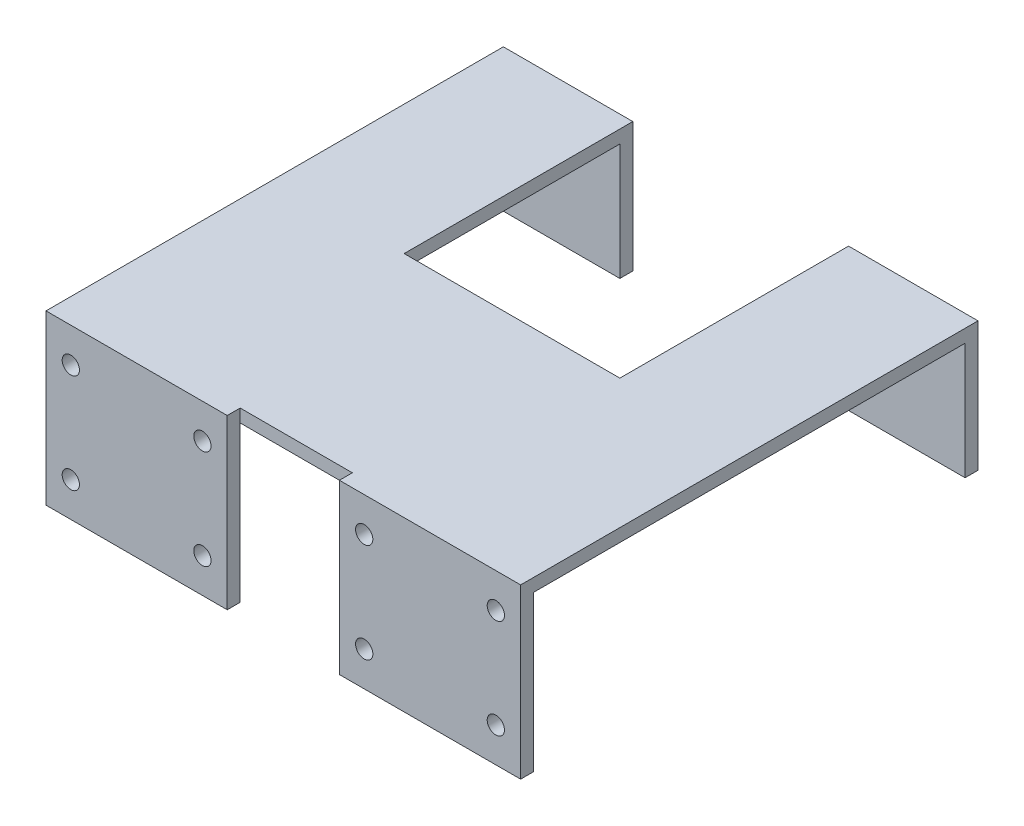
ISO-10303-21;
HEADER;
FILE_DESCRIPTION(('STEP AP214'),'2;1');
FILE_NAME('part.step','',(''),(''),'','','');
FILE_SCHEMA(('AUTOMOTIVE_DESIGN { 1 0 10303 214 1 1 1 1 }'));
ENDSEC;
DATA;
#1=APPLICATION_CONTEXT('core data for automotive mechanical design processes');
#2=APPLICATION_PROTOCOL_DEFINITION('international standard','automotive_design',2000,#1);
#3=PRODUCT_CONTEXT('',#1,'mechanical');
#4=PRODUCT('Part','Part','',(#3));
#5=PRODUCT_RELATED_PRODUCT_CATEGORY('part','',(#4));
#6=PRODUCT_DEFINITION_FORMATION('','',#4);
#7=PRODUCT_DEFINITION_CONTEXT('part definition',#1,'design');
#8=PRODUCT_DEFINITION('design','',#6,#7);
#9=PRODUCT_DEFINITION_SHAPE('','',#8);
#10=(LENGTH_UNIT() NAMED_UNIT(*) SI_UNIT(.MILLI.,.METRE.));
#11=(NAMED_UNIT(*) PLANE_ANGLE_UNIT() SI_UNIT($,.RADIAN.));
#12=(NAMED_UNIT(*) SI_UNIT($,.STERADIAN.) SOLID_ANGLE_UNIT());
#13=UNCERTAINTY_MEASURE_WITH_UNIT(LENGTH_MEASURE(1.E-05),#10,'distance_accuracy_value','');
#14=(GEOMETRIC_REPRESENTATION_CONTEXT(3) GLOBAL_UNCERTAINTY_ASSIGNED_CONTEXT((#13)) GLOBAL_UNIT_ASSIGNED_CONTEXT((#10,
#11,#12)) REPRESENTATION_CONTEXT('',''));
#15=CARTESIAN_POINT('',(0.,0.,0.));
#16=DIRECTION('',(0.,0.,1.));
#17=DIRECTION('',(1.,0.,0.));
#18=AXIS2_PLACEMENT_3D('',#15,#16,#17);
#19=CARTESIAN_POINT('',(-55.,3.,47.7190961890331));
#20=DIRECTION('',(0.,0.,-1.));
#21=DIRECTION('',(-1.,0.,0.));
#22=AXIS2_PLACEMENT_3D('',#19,#20,#21);
#23=PLANE('',#22);
#24=DIRECTION('',(0.,-1.,0.));
#25=VECTOR('',#24,1.);
#26=CARTESIAN_POINT('',(13.,3.,47.7190961890331));
#27=LINE('',#26,#25);
#28=CARTESIAN_POINT('',(13.,3.,47.7190961890331));
#29=VERTEX_POINT('',#28);
#30=CARTESIAN_POINT('',(13.,0.,47.7190961890331));
#31=VERTEX_POINT('',#30);
#32=EDGE_CURVE('E53',#29,#31,#27,.T.);
#33=ORIENTED_EDGE('',*,*,#32,.F.);
#34=DIRECTION('',(1.,0.,0.));
#35=VECTOR('',#34,1.);
#36=CARTESIAN_POINT('',(-55.,3.,47.7190961890331));
#37=LINE('',#36,#35);
#38=CARTESIAN_POINT('',(-13.,3.,47.7190961890331));
#39=VERTEX_POINT('',#38);
#40=EDGE_CURVE('E329',#39,#29,#37,.T.);
#41=ORIENTED_EDGE('',*,*,#40,.F.);
#42=DIRECTION('',(0.,1.,0.));
#43=VECTOR('',#42,1.);
#44=CARTESIAN_POINT('',(-13.,3.,47.7190961890331));
#45=LINE('',#44,#43);
#46=CARTESIAN_POINT('',(-13.,0.,47.7190961890331));
#47=VERTEX_POINT('',#46);
#48=EDGE_CURVE('E11',#47,#39,#45,.T.);
#49=ORIENTED_EDGE('',*,*,#48,.F.);
#50=DIRECTION('',(1.,0.,0.));
#51=VECTOR('',#50,1.);
#52=CARTESIAN_POINT('',(-55.,0.,47.7190961890331));
#53=LINE('',#52,#51);
#54=EDGE_CURVE('E349',#47,#31,#53,.T.);
#55=ORIENTED_EDGE('',*,*,#54,.T.);
#56=EDGE_LOOP('',(#33,#41,#49,#55));
#57=FACE_BOUND('',#56,.T.);
#58=ADVANCED_FACE('F36',(#57),#23,.F.);
#59=CARTESIAN_POINT('',(-55.,3.,-52.2809038109669));
#60=DIRECTION('',(1.,0.,0.));
#61=DIRECTION('',(0.,0.,-1.));
#62=AXIS2_PLACEMENT_3D('',#59,#60,#61);
#63=PLANE('',#62);
#64=DIRECTION('',(0.,0.,1.));
#65=VECTOR('',#64,1.);
#66=CARTESIAN_POINT('',(-55.,0.,-52.2809038109669));
#67=LINE('',#66,#65);
#68=CARTESIAN_POINT('',(-55.,0.,-52.2809038109669));
#69=VERTEX_POINT('',#68);
#70=CARTESIAN_POINT('',(-55.,0.,47.7190961890331));
#71=VERTEX_POINT('',#70);
#72=EDGE_CURVE('E343',#69,#71,#67,.T.);
#73=ORIENTED_EDGE('',*,*,#72,.T.);
#74=DIRECTION('',(0.,-1.,0.));
#75=VECTOR('',#74,1.);
#76=CARTESIAN_POINT('',(-55.,3.,47.7190961890331));
#77=LINE('',#76,#75);
#78=CARTESIAN_POINT('',(-55.,-36.,47.7190961890331));
#79=VERTEX_POINT('',#78);
#80=EDGE_CURVE('E300',#71,#79,#77,.T.);
#81=ORIENTED_EDGE('',*,*,#80,.T.);
#82=DIRECTION('',(0.,0.,-1.));
#83=VECTOR('',#82,1.);
#84=CARTESIAN_POINT('',(-55.,-36.,50.7190961890331));
#85=LINE('',#84,#83);
#86=CARTESIAN_POINT('',(-55.,-36.,50.7190961890331));
#87=VERTEX_POINT('',#86);
#88=EDGE_CURVE('E323',#87,#79,#85,.T.);
#89=ORIENTED_EDGE('',*,*,#88,.F.);
#90=DIRECTION('',(0.,-1.,0.));
#91=VECTOR('',#90,1.);
#92=CARTESIAN_POINT('',(-55.,3.,50.7190961890331));
#93=LINE('',#92,#91);
#94=CARTESIAN_POINT('',(-55.,3.,50.7190961890331));
#95=VERTEX_POINT('',#94);
#96=EDGE_CURVE('E303',#95,#87,#93,.T.);
#97=ORIENTED_EDGE('',*,*,#96,.F.);
#98=DIRECTION('',(0.,0.,1.));
#99=VECTOR('',#98,1.);
#100=CARTESIAN_POINT('',(-55.,3.,-52.2809038109669));
#101=LINE('',#100,#99);
#102=CARTESIAN_POINT('',(-55.,3.,-55.2809038109669));
#103=VERTEX_POINT('',#102);
#104=EDGE_CURVE('E327',#103,#95,#101,.T.);
#105=ORIENTED_EDGE('',*,*,#104,.F.);
#106=DIRECTION('',(0.,1.,0.));
#107=VECTOR('',#106,1.);
#108=CARTESIAN_POINT('',(-55.,3.,-55.2809038109669));
#109=LINE('',#108,#107);
#110=CARTESIAN_POINT('',(-55.,-27.,-55.2809038109669));
#111=VERTEX_POINT('',#110);
#112=EDGE_CURVE('E207',#111,#103,#109,.T.);
#113=ORIENTED_EDGE('',*,*,#112,.F.);
#114=DIRECTION('',(0.,0.,1.));
#115=VECTOR('',#114,1.);
#116=CARTESIAN_POINT('',(-55.,-27.,-55.2809038109669));
#117=LINE('',#116,#115);
#118=CARTESIAN_POINT('',(-55.,-27.,-52.2809038109669));
#119=VERTEX_POINT('',#118);
#120=EDGE_CURVE('E218',#111,#119,#117,.T.);
#121=ORIENTED_EDGE('',*,*,#120,.T.);
#122=DIRECTION('',(0.,1.,0.));
#123=VECTOR('',#122,1.);
#124=CARTESIAN_POINT('',(-55.,3.,-52.2809038109669));
#125=LINE('',#124,#123);
#126=EDGE_CURVE('E205',#119,#69,#125,.T.);
#127=ORIENTED_EDGE('',*,*,#126,.T.);
#128=EDGE_LOOP('',(#73,#81,#89,#97,#105,#113,#121,#127));
#129=FACE_BOUND('',#128,.T.);
#130=ADVANCED_FACE('F38',(#129),#63,.F.);
#131=CARTESIAN_POINT('',(55.,3.,47.7190961890331));
#132=DIRECTION('',(-1.,0.,0.));
#133=DIRECTION('',(0.,0.,1.));
#134=AXIS2_PLACEMENT_3D('',#131,#132,#133);
#135=PLANE('',#134);
#136=DIRECTION('',(0.,0.,-1.));
#137=VECTOR('',#136,1.);
#138=CARTESIAN_POINT('',(55.,0.,47.7190961890331));
#139=LINE('',#138,#137);
#140=CARTESIAN_POINT('',(55.,0.,47.7190961890331));
#141=VERTEX_POINT('',#140);
#142=CARTESIAN_POINT('',(55.,0.,-52.2809038109669));
#143=VERTEX_POINT('',#142);
#144=EDGE_CURVE('E348',#141,#143,#139,.T.);
#145=ORIENTED_EDGE('',*,*,#144,.T.);
#146=DIRECTION('',(0.,-1.,0.));
#147=VECTOR('',#146,1.);
#148=CARTESIAN_POINT('',(55.,3.,-52.2809038109669));
#149=LINE('',#148,#147);
#150=CARTESIAN_POINT('',(55.,-27.,-52.2809038109669));
#151=VERTEX_POINT('',#150);
#152=EDGE_CURVE('E194',#143,#151,#149,.T.);
#153=ORIENTED_EDGE('',*,*,#152,.T.);
#154=DIRECTION('',(0.,0.,1.));
#155=VECTOR('',#154,1.);
#156=CARTESIAN_POINT('',(55.,-27.,-55.2809038109669));
#157=LINE('',#156,#155);
#158=CARTESIAN_POINT('',(55.,-27.,-55.2809038109669));
#159=VERTEX_POINT('',#158);
#160=EDGE_CURVE('E174',#159,#151,#157,.T.);
#161=ORIENTED_EDGE('',*,*,#160,.F.);
#162=DIRECTION('',(0.,-1.,0.));
#163=VECTOR('',#162,1.);
#164=CARTESIAN_POINT('',(55.,3.,-55.2809038109669));
#165=LINE('',#164,#163);
#166=CARTESIAN_POINT('',(55.,3.,-55.2809038109669));
#167=VERTEX_POINT('',#166);
#168=EDGE_CURVE('E181',#167,#159,#165,.T.);
#169=ORIENTED_EDGE('',*,*,#168,.F.);
#170=DIRECTION('',(0.,0.,-1.));
#171=VECTOR('',#170,1.);
#172=CARTESIAN_POINT('',(55.,3.,47.7190961890331));
#173=LINE('',#172,#171);
#174=CARTESIAN_POINT('',(55.,3.,50.7190961890331));
#175=VERTEX_POINT('',#174);
#176=EDGE_CURVE('E332',#175,#167,#173,.T.);
#177=ORIENTED_EDGE('',*,*,#176,.F.);
#178=DIRECTION('',(0.,1.,0.));
#179=VECTOR('',#178,1.);
#180=CARTESIAN_POINT('',(55.,3.,50.7190961890331));
#181=LINE('',#180,#179);
#182=CARTESIAN_POINT('',(55.,-36.,50.7190961890331));
#183=VERTEX_POINT('',#182);
#184=EDGE_CURVE('E254',#183,#175,#181,.T.);
#185=ORIENTED_EDGE('',*,*,#184,.F.);
#186=DIRECTION('',(0.,0.,-1.));
#187=VECTOR('',#186,1.);
#188=CARTESIAN_POINT('',(55.,-36.,50.7190961890331));
#189=LINE('',#188,#187);
#190=CARTESIAN_POINT('',(55.,-36.,47.7190961890331));
#191=VERTEX_POINT('',#190);
#192=EDGE_CURVE('E264',#183,#191,#189,.T.);
#193=ORIENTED_EDGE('',*,*,#192,.T.);
#194=DIRECTION('',(0.,1.,0.));
#195=VECTOR('',#194,1.);
#196=CARTESIAN_POINT('',(55.,3.,47.7190961890331));
#197=LINE('',#196,#195);
#198=EDGE_CURVE('E251',#191,#141,#197,.T.);
#199=ORIENTED_EDGE('',*,*,#198,.T.);
#200=EDGE_LOOP('',(#145,#153,#161,#169,#177,#185,#193,#199));
#201=FACE_BOUND('',#200,.T.);
#202=ADVANCED_FACE('F192',(#201),#135,.F.);
#203=CARTESIAN_POINT('',(25.,3.,-52.2809038109669));
#204=DIRECTION('',(1.,0.,0.));
#205=DIRECTION('',(0.,0.,-1.));
#206=AXIS2_PLACEMENT_3D('',#203,#204,#205);
#207=PLANE('',#206);
#208=DIRECTION('',(0.,0.,1.));
#209=VECTOR('',#208,1.);
#210=CARTESIAN_POINT('',(25.,0.,-52.2809038109669));
#211=LINE('',#210,#209);
#212=CARTESIAN_POINT('',(25.,0.,-52.2809038109669));
#213=VERTEX_POINT('',#212);
#214=CARTESIAN_POINT('',(25.,0.,-2.28090381096689));
#215=VERTEX_POINT('',#214);
#216=EDGE_CURVE('E354',#213,#215,#211,.T.);
#217=ORIENTED_EDGE('',*,*,#216,.T.);
#218=DIRECTION('',(0.,-1.,0.));
#219=VECTOR('',#218,1.);
#220=CARTESIAN_POINT('',(25.,3.,-2.28090381096689));
#221=LINE('',#220,#219);
#222=CARTESIAN_POINT('',(25.,3.,-2.28090381096689));
#223=VERTEX_POINT('',#222);
#224=EDGE_CURVE('E40',#223,#215,#221,.T.);
#225=ORIENTED_EDGE('',*,*,#224,.F.);
#226=DIRECTION('',(0.,0.,1.));
#227=VECTOR('',#226,1.);
#228=CARTESIAN_POINT('',(25.,3.,-52.2809038109669));
#229=LINE('',#228,#227);
#230=CARTESIAN_POINT('',(25.,3.,-55.2809038109669));
#231=VERTEX_POINT('',#230);
#232=EDGE_CURVE('E334',#231,#223,#229,.T.);
#233=ORIENTED_EDGE('',*,*,#232,.F.);
#234=DIRECTION('',(0.,1.,0.));
#235=VECTOR('',#234,1.);
#236=CARTESIAN_POINT('',(25.,3.,-55.2809038109669));
#237=LINE('',#236,#235);
#238=CARTESIAN_POINT('',(25.,-27.,-55.2809038109669));
#239=VERTEX_POINT('',#238);
#240=EDGE_CURVE('E180',#239,#231,#237,.T.);
#241=ORIENTED_EDGE('',*,*,#240,.F.);
#242=DIRECTION('',(0.,0.,1.));
#243=VECTOR('',#242,1.);
#244=CARTESIAN_POINT('',(25.,-27.,-55.2809038109669));
#245=LINE('',#244,#243);
#246=CARTESIAN_POINT('',(25.,-27.,-52.2809038109669));
#247=VERTEX_POINT('',#246);
#248=EDGE_CURVE('E176',#239,#247,#245,.T.);
#249=ORIENTED_EDGE('',*,*,#248,.T.);
#250=DIRECTION('',(0.,1.,0.));
#251=VECTOR('',#250,1.);
#252=CARTESIAN_POINT('',(25.,3.,-52.2809038109669));
#253=LINE('',#252,#251);
#254=EDGE_CURVE('E190',#247,#213,#253,.T.);
#255=ORIENTED_EDGE('',*,*,#254,.T.);
#256=EDGE_LOOP('',(#217,#225,#233,#241,#249,#255));
#257=FACE_BOUND('',#256,.T.);
#258=ADVANCED_FACE('F395',(#257),#207,.F.);
#259=CARTESIAN_POINT('',(25.,3.,-2.28090381096689));
#260=DIRECTION('',(0.,0.,1.));
#261=DIRECTION('',(1.,0.,0.));
#262=AXIS2_PLACEMENT_3D('',#259,#260,#261);
#263=PLANE('',#262);
#264=DIRECTION('',(-1.,0.,0.));
#265=VECTOR('',#264,1.);
#266=CARTESIAN_POINT('',(25.,0.,-2.28090381096689));
#267=LINE('',#266,#265);
#268=CARTESIAN_POINT('',(-25.,0.,-2.28090381096689));
#269=VERTEX_POINT('',#268);
#270=EDGE_CURVE('E356',#215,#269,#267,.T.);
#271=ORIENTED_EDGE('',*,*,#270,.T.);
#272=DIRECTION('',(0.,-1.,0.));
#273=VECTOR('',#272,1.);
#274=CARTESIAN_POINT('',(-25.,3.,-2.28090381096689));
#275=LINE('',#274,#273);
#276=CARTESIAN_POINT('',(-25.,3.,-2.28090381096689));
#277=VERTEX_POINT('',#276);
#278=EDGE_CURVE('E340',#277,#269,#275,.T.);
#279=ORIENTED_EDGE('',*,*,#278,.F.);
#280=DIRECTION('',(-1.,0.,0.));
#281=VECTOR('',#280,1.);
#282=CARTESIAN_POINT('',(25.,3.,-2.28090381096689));
#283=LINE('',#282,#281);
#284=EDGE_CURVE('E336',#223,#277,#283,.T.);
#285=ORIENTED_EDGE('',*,*,#284,.F.);
#286=ORIENTED_EDGE('',*,*,#224,.T.);
#287=EDGE_LOOP('',(#271,#279,#285,#286));
#288=FACE_BOUND('',#287,.T.);
#289=ADVANCED_FACE('F368',(#288),#263,.F.);
#290=CARTESIAN_POINT('',(-25.,3.,-2.28090381096689));
#291=DIRECTION('',(-1.,0.,0.));
#292=DIRECTION('',(0.,0.,1.));
#293=AXIS2_PLACEMENT_3D('',#290,#291,#292);
#294=PLANE('',#293);
#295=DIRECTION('',(0.,0.,-1.));
#296=VECTOR('',#295,1.);
#297=CARTESIAN_POINT('',(-25.,0.,-2.28090381096689));
#298=LINE('',#297,#296);
#299=CARTESIAN_POINT('',(-25.,0.,-52.2809038109669));
#300=VERTEX_POINT('',#299);
#301=EDGE_CURVE('E330',#269,#300,#298,.T.);
#302=ORIENTED_EDGE('',*,*,#301,.T.);
#303=DIRECTION('',(0.,-1.,0.));
#304=VECTOR('',#303,1.);
#305=CARTESIAN_POINT('',(-25.,3.,-52.2809038109669));
#306=LINE('',#305,#304);
#307=CARTESIAN_POINT('',(-25.,-27.,-52.2809038109669));
#308=VERTEX_POINT('',#307);
#309=EDGE_CURVE('E221',#300,#308,#306,.T.);
#310=ORIENTED_EDGE('',*,*,#309,.T.);
#311=DIRECTION('',(0.,0.,1.));
#312=VECTOR('',#311,1.);
#313=CARTESIAN_POINT('',(-25.,-27.,-55.2809038109669));
#314=LINE('',#313,#312);
#315=CARTESIAN_POINT('',(-25.,-27.,-55.2809038109669));
#316=VERTEX_POINT('',#315);
#317=EDGE_CURVE('E226',#316,#308,#314,.T.);
#318=ORIENTED_EDGE('',*,*,#317,.F.);
#319=DIRECTION('',(0.,-1.,0.));
#320=VECTOR('',#319,1.);
#321=CARTESIAN_POINT('',(-25.,3.,-55.2809038109669));
#322=LINE('',#321,#320);
#323=CARTESIAN_POINT('',(-25.,3.,-55.2809038109669));
#324=VERTEX_POINT('',#323);
#325=EDGE_CURVE('E214',#324,#316,#322,.T.);
#326=ORIENTED_EDGE('',*,*,#325,.F.);
#327=DIRECTION('',(0.,0.,-1.));
#328=VECTOR('',#327,1.);
#329=CARTESIAN_POINT('',(-25.,3.,-2.28090381096689));
#330=LINE('',#329,#328);
#331=EDGE_CURVE('E338',#277,#324,#330,.T.);
#332=ORIENTED_EDGE('',*,*,#331,.F.);
#333=ORIENTED_EDGE('',*,*,#278,.T.);
#334=EDGE_LOOP('',(#302,#310,#318,#326,#332,#333));
#335=FACE_BOUND('',#334,.T.);
#336=ADVANCED_FACE('F374',(#335),#294,.F.);
#337=CARTESIAN_POINT('',(0.,3.,0.));
#338=DIRECTION('',(0.,1.,0.));
#339=DIRECTION('',(0.,0.,1.));
#340=AXIS2_PLACEMENT_3D('',#337,#338,#339);
#341=PLANE('',#340);
#342=ORIENTED_EDGE('',*,*,#331,.T.);
#343=DIRECTION('',(1.,0.,0.));
#344=VECTOR('',#343,1.);
#345=CARTESIAN_POINT('',(-55.,3.,-55.2809038109669));
#346=LINE('',#345,#344);
#347=EDGE_CURVE('E210',#103,#324,#346,.T.);
#348=ORIENTED_EDGE('',*,*,#347,.F.);
#349=ORIENTED_EDGE('',*,*,#104,.T.);
#350=DIRECTION('',(-1.,0.,0.));
#351=VECTOR('',#350,1.);
#352=CARTESIAN_POINT('',(-55.,3.,50.7190961890331));
#353=LINE('',#352,#351);
#354=CARTESIAN_POINT('',(-13.,3.,50.7190961890331));
#355=VERTEX_POINT('',#354);
#356=EDGE_CURVE('E310',#355,#95,#353,.T.);
#357=ORIENTED_EDGE('',*,*,#356,.F.);
#358=DIRECTION('',(0.,0.,-1.));
#359=VECTOR('',#358,1.);
#360=CARTESIAN_POINT('',(-13.,3.,50.7190961890331));
#361=LINE('',#360,#359);
#362=EDGE_CURVE('E313',#355,#39,#361,.T.);
#363=ORIENTED_EDGE('',*,*,#362,.T.);
#364=ORIENTED_EDGE('',*,*,#40,.T.);
#365=DIRECTION('',(0.,0.,-1.));
#366=VECTOR('',#365,1.);
#367=CARTESIAN_POINT('',(13.,3.,50.7190961890331));
#368=LINE('',#367,#366);
#369=CARTESIAN_POINT('',(13.,3.,50.7190961890331));
#370=VERTEX_POINT('',#369);
#371=EDGE_CURVE('E275',#370,#29,#368,.T.);
#372=ORIENTED_EDGE('',*,*,#371,.F.);
#373=DIRECTION('',(-1.,0.,0.));
#374=VECTOR('',#373,1.);
#375=CARTESIAN_POINT('',(55.,3.,50.7190961890331));
#376=LINE('',#375,#374);
#377=EDGE_CURVE('E257',#175,#370,#376,.T.);
#378=ORIENTED_EDGE('',*,*,#377,.F.);
#379=ORIENTED_EDGE('',*,*,#176,.T.);
#380=DIRECTION('',(1.,0.,0.));
#381=VECTOR('',#380,1.);
#382=CARTESIAN_POINT('',(55.,3.,-55.2809038109669));
#383=LINE('',#382,#381);
#384=EDGE_CURVE('E188',#231,#167,#383,.T.);
#385=ORIENTED_EDGE('',*,*,#384,.F.);
#386=ORIENTED_EDGE('',*,*,#232,.T.);
#387=ORIENTED_EDGE('',*,*,#284,.T.);
#388=EDGE_LOOP('',(#342,#348,#349,#357,#363,#364,#372,#378,#379,#385,#386,#387));
#389=FACE_BOUND('',#388,.T.);
#390=ADVANCED_FACE('F394',(#389),#341,.T.);
#391=CARTESIAN_POINT('',(0.,0.,0.));
#392=DIRECTION('',(0.,1.,0.));
#393=DIRECTION('',(0.,0.,1.));
#394=AXIS2_PLACEMENT_3D('',#391,#392,#393);
#395=PLANE('',#394);
#396=DIRECTION('',(-1.,0.,0.));
#397=VECTOR('',#396,1.);
#398=CARTESIAN_POINT('',(-25.,0.,-52.2809038109669));
#399=LINE('',#398,#397);
#400=EDGE_CURVE('E326',#300,#69,#399,.T.);
#401=ORIENTED_EDGE('',*,*,#400,.F.);
#402=ORIENTED_EDGE('',*,*,#301,.F.);
#403=ORIENTED_EDGE('',*,*,#270,.F.);
#404=ORIENTED_EDGE('',*,*,#216,.F.);
#405=DIRECTION('',(-1.,0.,0.));
#406=VECTOR('',#405,1.);
#407=CARTESIAN_POINT('',(55.,0.,-52.2809038109669));
#408=LINE('',#407,#406);
#409=EDGE_CURVE('E351',#143,#213,#408,.T.);
#410=ORIENTED_EDGE('',*,*,#409,.F.);
#411=ORIENTED_EDGE('',*,*,#144,.F.);
#412=EDGE_CURVE('E61',#31,#141,#53,.T.);
#413=ORIENTED_EDGE('',*,*,#412,.F.);
#414=ORIENTED_EDGE('',*,*,#54,.F.);
#415=EDGE_CURVE('E345',#71,#47,#53,.T.);
#416=ORIENTED_EDGE('',*,*,#415,.F.);
#417=ORIENTED_EDGE('',*,*,#72,.F.);
#418=EDGE_LOOP('',(#401,#402,#403,#404,#410,#411,#413,#414,#416,#417));
#419=FACE_BOUND('',#418,.T.);
#420=ADVANCED_FACE('F371',(#419),#395,.F.);
#421=CARTESIAN_POINT('',(0.,0.,47.7190961890331));
#422=DIRECTION('',(0.,0.,1.));
#423=DIRECTION('',(1.,0.,0.));
#424=AXIS2_PLACEMENT_3D('',#421,#422,#423);
#425=PLANE('',#424);
#426=CARTESIAN_POINT('',(-18.75,-5.,47.7190961890331));
#427=DIRECTION('',(0.,0.,1.));
#428=DIRECTION('',(1.,0.,0.));
#429=AXIS2_PLACEMENT_3D('',#426,#427,#428);
#430=CIRCLE('',#429,2.);
#431=CARTESIAN_POINT('',(-16.75,-5.,47.7190961890331));
#432=VERTEX_POINT('',#431);
#433=EDGE_CURVE('E294',#432,#432,#430,.T.);
#434=ORIENTED_EDGE('',*,*,#433,.T.);
#435=EDGE_LOOP('',(#434));
#436=FACE_BOUND('',#435,.T.);
#437=CARTESIAN_POINT('',(-49.25,-5.,47.7190961890331));
#438=DIRECTION('',(0.,0.,1.));
#439=DIRECTION('',(-1.,0.,0.));
#440=AXIS2_PLACEMENT_3D('',#437,#438,#439);
#441=CIRCLE('',#440,2.);
#442=CARTESIAN_POINT('',(-51.25,-5.,47.7190961890331));
#443=VERTEX_POINT('',#442);
#444=EDGE_CURVE('E288',#443,#443,#441,.T.);
#445=ORIENTED_EDGE('',*,*,#444,.T.);
#446=EDGE_LOOP('',(#445));
#447=FACE_BOUND('',#446,.T.);
#448=CARTESIAN_POINT('',(-18.75,-28.,47.7190961890331));
#449=DIRECTION('',(0.,0.,1.));
#450=DIRECTION('',(-1.,0.,0.));
#451=AXIS2_PLACEMENT_3D('',#448,#449,#450);
#452=CIRCLE('',#451,2.);
#453=CARTESIAN_POINT('',(-20.75,-28.,47.7190961890331));
#454=VERTEX_POINT('',#453);
#455=EDGE_CURVE('E282',#454,#454,#452,.T.);
#456=ORIENTED_EDGE('',*,*,#455,.T.);
#457=EDGE_LOOP('',(#456));
#458=FACE_BOUND('',#457,.T.);
#459=CARTESIAN_POINT('',(-49.25,-28.,47.7190961890331));
#460=DIRECTION('',(0.,0.,1.));
#461=DIRECTION('',(1.,0.,0.));
#462=AXIS2_PLACEMENT_3D('',#459,#460,#461);
#463=CIRCLE('',#462,2.);
#464=CARTESIAN_POINT('',(-47.25,-28.,47.7190961890331));
#465=VERTEX_POINT('',#464);
#466=EDGE_CURVE('E278',#465,#465,#463,.T.);
#467=ORIENTED_EDGE('',*,*,#466,.T.);
#468=EDGE_LOOP('',(#467));
#469=FACE_BOUND('',#468,.T.);
#470=ORIENTED_EDGE('',*,*,#80,.F.);
#471=ORIENTED_EDGE('',*,*,#415,.T.);
#472=CARTESIAN_POINT('',(-13.,-36.,47.7190961890331));
#473=VERTEX_POINT('',#472);
#474=EDGE_CURVE('E46',#473,#47,#45,.T.);
#475=ORIENTED_EDGE('',*,*,#474,.F.);
#476=DIRECTION('',(1.,0.,0.));
#477=VECTOR('',#476,1.);
#478=CARTESIAN_POINT('',(-55.,-36.,47.7190961890331));
#479=LINE('',#478,#477);
#480=EDGE_CURVE('E315',#79,#473,#479,.T.);
#481=ORIENTED_EDGE('',*,*,#480,.F.);
#482=EDGE_LOOP('',(#470,#471,#475,#481));
#483=FACE_BOUND('',#482,.T.);
#484=ADVANCED_FACE('F432',(#436,#447,#458,#469,#483),#425,.F.);
#485=CARTESIAN_POINT('',(0.,0.,50.7190961890331));
#486=DIRECTION('',(0.,0.,1.));
#487=DIRECTION('',(1.,0.,0.));
#488=AXIS2_PLACEMENT_3D('',#485,#486,#487);
#489=PLANE('',#488);
#490=CARTESIAN_POINT('',(-18.75,-28.,50.7190961890331));
#491=DIRECTION('',(0.,0.,1.));
#492=DIRECTION('',(-1.,0.,0.));
#493=AXIS2_PLACEMENT_3D('',#490,#491,#492);
#494=CIRCLE('',#493,2.);
#495=CARTESIAN_POINT('',(-20.75,-28.,50.7190961890331));
#496=VERTEX_POINT('',#495);
#497=EDGE_CURVE('E285',#496,#496,#494,.T.);
#498=ORIENTED_EDGE('',*,*,#497,.F.);
#499=EDGE_LOOP('',(#498));
#500=FACE_BOUND('',#499,.T.);
#501=CARTESIAN_POINT('',(-18.75,-5.,50.7190961890331));
#502=DIRECTION('',(0.,0.,1.));
#503=DIRECTION('',(1.,0.,0.));
#504=AXIS2_PLACEMENT_3D('',#501,#502,#503);
#505=CIRCLE('',#504,2.);
#506=CARTESIAN_POINT('',(-16.75,-5.,50.7190961890331));
#507=VERTEX_POINT('',#506);
#508=EDGE_CURVE('E297',#507,#507,#505,.T.);
#509=ORIENTED_EDGE('',*,*,#508,.F.);
#510=EDGE_LOOP('',(#509));
#511=FACE_BOUND('',#510,.T.);
#512=ORIENTED_EDGE('',*,*,#96,.T.);
#513=DIRECTION('',(1.,0.,0.));
#514=VECTOR('',#513,1.);
#515=CARTESIAN_POINT('',(-55.,-36.,50.7190961890331));
#516=LINE('',#515,#514);
#517=CARTESIAN_POINT('',(-13.,-36.,50.7190961890331));
#518=VERTEX_POINT('',#517);
#519=EDGE_CURVE('E306',#87,#518,#516,.T.);
#520=ORIENTED_EDGE('',*,*,#519,.T.);
#521=DIRECTION('',(0.,1.,0.));
#522=VECTOR('',#521,1.);
#523=CARTESIAN_POINT('',(-13.,3.,50.7190961890331));
#524=LINE('',#523,#522);
#525=EDGE_CURVE('E308',#518,#355,#524,.T.);
#526=ORIENTED_EDGE('',*,*,#525,.T.);
#527=ORIENTED_EDGE('',*,*,#356,.T.);
#528=EDGE_LOOP('',(#512,#520,#526,#527));
#529=FACE_BOUND('',#528,.T.);
#530=CARTESIAN_POINT('',(-49.25,-5.,50.7190961890331));
#531=DIRECTION('',(0.,0.,1.));
#532=DIRECTION('',(-1.,0.,0.));
#533=AXIS2_PLACEMENT_3D('',#530,#531,#532);
#534=CIRCLE('',#533,2.);
#535=CARTESIAN_POINT('',(-51.25,-5.,50.7190961890331));
#536=VERTEX_POINT('',#535);
#537=EDGE_CURVE('E291',#536,#536,#534,.T.);
#538=ORIENTED_EDGE('',*,*,#537,.F.);
#539=EDGE_LOOP('',(#538));
#540=FACE_BOUND('',#539,.T.);
#541=CARTESIAN_POINT('',(-49.25,-28.,50.7190961890331));
#542=DIRECTION('',(0.,0.,1.));
#543=DIRECTION('',(1.,0.,0.));
#544=AXIS2_PLACEMENT_3D('',#541,#542,#543);
#545=CIRCLE('',#544,2.);
#546=CARTESIAN_POINT('',(-47.25,-28.,50.7190961890331));
#547=VERTEX_POINT('',#546);
#548=EDGE_CURVE('E279',#547,#547,#545,.T.);
#549=ORIENTED_EDGE('',*,*,#548,.F.);
#550=EDGE_LOOP('',(#549));
#551=FACE_BOUND('',#550,.T.);
#552=ADVANCED_FACE('F437',(#500,#511,#529,#540,#551),#489,.T.);
#553=CARTESIAN_POINT('',(-55.,-36.,50.7190961890331));
#554=DIRECTION('',(0.,1.,0.));
#555=DIRECTION('',(0.,0.,1.));
#556=AXIS2_PLACEMENT_3D('',#553,#554,#555);
#557=PLANE('',#556);
#558=ORIENTED_EDGE('',*,*,#480,.T.);
#559=DIRECTION('',(0.,0.,-1.));
#560=VECTOR('',#559,1.);
#561=CARTESIAN_POINT('',(-13.,-36.,50.7190961890331));
#562=LINE('',#561,#560);
#563=EDGE_CURVE('E320',#518,#473,#562,.T.);
#564=ORIENTED_EDGE('',*,*,#563,.F.);
#565=ORIENTED_EDGE('',*,*,#519,.F.);
#566=ORIENTED_EDGE('',*,*,#88,.T.);
#567=EDGE_LOOP('',(#558,#564,#565,#566));
#568=FACE_BOUND('',#567,.T.);
#569=ADVANCED_FACE('F435',(#568),#557,.F.);
#570=CARTESIAN_POINT('',(-13.,3.,50.7190961890331));
#571=DIRECTION('',(-1.,0.,0.));
#572=DIRECTION('',(0.,0.,1.));
#573=AXIS2_PLACEMENT_3D('',#570,#571,#572);
#574=PLANE('',#573);
#575=ORIENTED_EDGE('',*,*,#474,.T.);
#576=ORIENTED_EDGE('',*,*,#48,.T.);
#577=ORIENTED_EDGE('',*,*,#362,.F.);
#578=ORIENTED_EDGE('',*,*,#525,.F.);
#579=ORIENTED_EDGE('',*,*,#563,.T.);
#580=EDGE_LOOP('',(#575,#576,#577,#578,#579));
#581=FACE_BOUND('',#580,.T.);
#582=ADVANCED_FACE('F425',(#581),#574,.F.);
#583=CARTESIAN_POINT('',(-18.75,-5.,50.7190961890331));
#584=DIRECTION('',(0.,0.,-1.));
#585=DIRECTION('',(-1.,0.,0.));
#586=AXIS2_PLACEMENT_3D('',#583,#584,#585);
#587=CYLINDRICAL_SURFACE('',#586,2.);
#588=ORIENTED_EDGE('',*,*,#508,.T.);
#589=EDGE_LOOP('',(#588));
#590=FACE_BOUND('',#589,.T.);
#591=ORIENTED_EDGE('',*,*,#433,.F.);
#592=EDGE_LOOP('',(#591));
#593=FACE_BOUND('',#592,.T.);
#594=ADVANCED_FACE('F479',(#590,#593),#587,.F.);
#595=CARTESIAN_POINT('',(-49.25,-5.,50.7190961890331));
#596=DIRECTION('',(0.,0.,-1.));
#597=DIRECTION('',(-1.,0.,0.));
#598=AXIS2_PLACEMENT_3D('',#595,#596,#597);
#599=CYLINDRICAL_SURFACE('',#598,2.);
#600=ORIENTED_EDGE('',*,*,#537,.T.);
#601=EDGE_LOOP('',(#600));
#602=FACE_BOUND('',#601,.T.);
#603=ORIENTED_EDGE('',*,*,#444,.F.);
#604=EDGE_LOOP('',(#603));
#605=FACE_BOUND('',#604,.T.);
#606=ADVANCED_FACE('F483',(#602,#605),#599,.F.);
#607=CARTESIAN_POINT('',(-18.75,-28.,50.7190961890331));
#608=DIRECTION('',(0.,0.,-1.));
#609=DIRECTION('',(-1.,0.,0.));
#610=AXIS2_PLACEMENT_3D('',#607,#608,#609);
#611=CYLINDRICAL_SURFACE('',#610,2.);
#612=ORIENTED_EDGE('',*,*,#497,.T.);
#613=EDGE_LOOP('',(#612));
#614=FACE_BOUND('',#613,.T.);
#615=ORIENTED_EDGE('',*,*,#455,.F.);
#616=EDGE_LOOP('',(#615));
#617=FACE_BOUND('',#616,.T.);
#618=ADVANCED_FACE('F449',(#614,#617),#611,.F.);
#619=CARTESIAN_POINT('',(-49.25,-28.,50.7190961890331));
#620=DIRECTION('',(0.,0.,-1.));
#621=DIRECTION('',(-1.,0.,0.));
#622=AXIS2_PLACEMENT_3D('',#619,#620,#621);
#623=CYLINDRICAL_SURFACE('',#622,2.);
#624=ORIENTED_EDGE('',*,*,#548,.T.);
#625=EDGE_LOOP('',(#624));
#626=FACE_BOUND('',#625,.T.);
#627=ORIENTED_EDGE('',*,*,#466,.F.);
#628=EDGE_LOOP('',(#627));
#629=FACE_BOUND('',#628,.T.);
#630=ADVANCED_FACE('F446',(#626,#629),#623,.F.);
#631=CARTESIAN_POINT('',(0.,0.,47.7190961890331));
#632=DIRECTION('',(0.,0.,-1.));
#633=DIRECTION('',(-1.,0.,0.));
#634=AXIS2_PLACEMENT_3D('',#631,#632,#633);
#635=PLANE('',#634);
#636=CARTESIAN_POINT('',(18.75,-28.,47.7190961890331));
#637=DIRECTION('',(0.,0.,1.));
#638=DIRECTION('',(1.,0.,0.));
#639=AXIS2_PLACEMENT_3D('',#636,#637,#638);
#640=CIRCLE('',#639,2.);
#641=CARTESIAN_POINT('',(20.75,-28.,47.7190961890331));
#642=VERTEX_POINT('',#641);
#643=EDGE_CURVE('E229',#642,#642,#640,.T.);
#644=ORIENTED_EDGE('',*,*,#643,.T.);
#645=EDGE_LOOP('',(#644));
#646=FACE_BOUND('',#645,.T.);
#647=CARTESIAN_POINT('',(49.25,-28.,47.7190961890331));
#648=DIRECTION('',(0.,0.,1.));
#649=DIRECTION('',(-1.,0.,0.));
#650=AXIS2_PLACEMENT_3D('',#647,#648,#649);
#651=CIRCLE('',#650,2.);
#652=CARTESIAN_POINT('',(47.25,-28.,47.7190961890331));
#653=VERTEX_POINT('',#652);
#654=EDGE_CURVE('E239',#653,#653,#651,.T.);
#655=ORIENTED_EDGE('',*,*,#654,.T.);
#656=EDGE_LOOP('',(#655));
#657=FACE_BOUND('',#656,.T.);
#658=CARTESIAN_POINT('',(49.25,-5.,47.7190961890331));
#659=DIRECTION('',(0.,0.,1.));
#660=DIRECTION('',(1.,0.,0.));
#661=AXIS2_PLACEMENT_3D('',#658,#659,#660);
#662=CIRCLE('',#661,2.);
#663=CARTESIAN_POINT('',(51.25,-5.,47.7190961890331));
#664=VERTEX_POINT('',#663);
#665=EDGE_CURVE('E245',#664,#664,#662,.T.);
#666=ORIENTED_EDGE('',*,*,#665,.T.);
#667=EDGE_LOOP('',(#666));
#668=FACE_BOUND('',#667,.T.);
#669=CARTESIAN_POINT('',(18.75,-5.,47.7190961890331));
#670=DIRECTION('',(0.,0.,1.));
#671=DIRECTION('',(-1.,0.,0.));
#672=AXIS2_PLACEMENT_3D('',#669,#670,#671);
#673=CIRCLE('',#672,2.);
#674=CARTESIAN_POINT('',(16.75,-5.,47.7190961890331));
#675=VERTEX_POINT('',#674);
#676=EDGE_CURVE('E233',#675,#675,#673,.T.);
#677=ORIENTED_EDGE('',*,*,#676,.T.);
#678=EDGE_LOOP('',(#677));
#679=FACE_BOUND('',#678,.T.);
#680=ORIENTED_EDGE('',*,*,#412,.T.);
#681=ORIENTED_EDGE('',*,*,#198,.F.);
#682=DIRECTION('',(1.,0.,0.));
#683=VECTOR('',#682,1.);
#684=CARTESIAN_POINT('',(55.,-36.,47.7190961890331));
#685=LINE('',#684,#683);
#686=CARTESIAN_POINT('',(13.,-36.,47.7190961890331));
#687=VERTEX_POINT('',#686);
#688=EDGE_CURVE('E258',#687,#191,#685,.T.);
#689=ORIENTED_EDGE('',*,*,#688,.F.);
#690=EDGE_CURVE('E267',#31,#687,#27,.T.);
#691=ORIENTED_EDGE('',*,*,#690,.F.);
#692=EDGE_LOOP('',(#680,#681,#689,#691));
#693=FACE_BOUND('',#692,.T.);
#694=ADVANCED_FACE('F409',(#646,#657,#668,#679,#693),#635,.T.);
#695=CARTESIAN_POINT('',(0.,0.,50.7190961890331));
#696=DIRECTION('',(0.,0.,-1.));
#697=DIRECTION('',(-1.,0.,0.));
#698=AXIS2_PLACEMENT_3D('',#695,#696,#697);
#699=PLANE('',#698);
#700=ORIENTED_EDGE('',*,*,#184,.T.);
#701=ORIENTED_EDGE('',*,*,#377,.T.);
#702=DIRECTION('',(0.,-1.,0.));
#703=VECTOR('',#702,1.);
#704=CARTESIAN_POINT('',(13.,3.,50.7190961890331));
#705=LINE('',#704,#703);
#706=CARTESIAN_POINT('',(13.,-36.,50.7190961890331));
#707=VERTEX_POINT('',#706);
#708=EDGE_CURVE('E260',#370,#707,#705,.T.);
#709=ORIENTED_EDGE('',*,*,#708,.T.);
#710=DIRECTION('',(1.,0.,0.));
#711=VECTOR('',#710,1.);
#712=CARTESIAN_POINT('',(55.,-36.,50.7190961890331));
#713=LINE('',#712,#711);
#714=EDGE_CURVE('E262',#707,#183,#713,.T.);
#715=ORIENTED_EDGE('',*,*,#714,.T.);
#716=EDGE_LOOP('',(#700,#701,#709,#715));
#717=FACE_BOUND('',#716,.T.);
#718=CARTESIAN_POINT('',(49.25,-5.,50.7190961890331));
#719=DIRECTION('',(0.,0.,1.));
#720=DIRECTION('',(1.,0.,0.));
#721=AXIS2_PLACEMENT_3D('',#718,#719,#720);
#722=CIRCLE('',#721,2.);
#723=CARTESIAN_POINT('',(51.25,-5.,50.7190961890331));
#724=VERTEX_POINT('',#723);
#725=EDGE_CURVE('E248',#724,#724,#722,.T.);
#726=ORIENTED_EDGE('',*,*,#725,.F.);
#727=EDGE_LOOP('',(#726));
#728=FACE_BOUND('',#727,.T.);
#729=CARTESIAN_POINT('',(49.25,-28.,50.7190961890331));
#730=DIRECTION('',(0.,0.,1.));
#731=DIRECTION('',(-1.,0.,0.));
#732=AXIS2_PLACEMENT_3D('',#729,#730,#731);
#733=CIRCLE('',#732,2.);
#734=CARTESIAN_POINT('',(47.25,-28.,50.7190961890331));
#735=VERTEX_POINT('',#734);
#736=EDGE_CURVE('E242',#735,#735,#733,.T.);
#737=ORIENTED_EDGE('',*,*,#736,.F.);
#738=EDGE_LOOP('',(#737));
#739=FACE_BOUND('',#738,.T.);
#740=CARTESIAN_POINT('',(18.75,-5.,50.7190961890331));
#741=DIRECTION('',(0.,0.,1.));
#742=DIRECTION('',(-1.,0.,0.));
#743=AXIS2_PLACEMENT_3D('',#740,#741,#742);
#744=CIRCLE('',#743,2.);
#745=CARTESIAN_POINT('',(16.75,-5.,50.7190961890331));
#746=VERTEX_POINT('',#745);
#747=EDGE_CURVE('E236',#746,#746,#744,.T.);
#748=ORIENTED_EDGE('',*,*,#747,.F.);
#749=EDGE_LOOP('',(#748));
#750=FACE_BOUND('',#749,.T.);
#751=CARTESIAN_POINT('',(18.75,-28.,50.7190961890331));
#752=DIRECTION('',(0.,0.,1.));
#753=DIRECTION('',(1.,0.,0.));
#754=AXIS2_PLACEMENT_3D('',#751,#752,#753);
#755=CIRCLE('',#754,2.);
#756=CARTESIAN_POINT('',(20.75,-28.,50.7190961890331));
#757=VERTEX_POINT('',#756);
#758=EDGE_CURVE('E230',#757,#757,#755,.T.);
#759=ORIENTED_EDGE('',*,*,#758,.F.);
#760=EDGE_LOOP('',(#759));
#761=FACE_BOUND('',#760,.T.);
#762=ADVANCED_FACE('F498',(#717,#728,#739,#750,#761),#699,.F.);
#763=CARTESIAN_POINT('',(13.,3.,50.7190961890331));
#764=DIRECTION('',(1.,0.,0.));
#765=DIRECTION('',(0.,1.,0.));
#766=AXIS2_PLACEMENT_3D('',#763,#764,#765);
#767=PLANE('',#766);
#768=ORIENTED_EDGE('',*,*,#32,.T.);
#769=ORIENTED_EDGE('',*,*,#690,.T.);
#770=DIRECTION('',(0.,0.,-1.));
#771=VECTOR('',#770,1.);
#772=CARTESIAN_POINT('',(13.,-36.,50.7190961890331));
#773=LINE('',#772,#771);
#774=EDGE_CURVE('E272',#707,#687,#773,.T.);
#775=ORIENTED_EDGE('',*,*,#774,.F.);
#776=ORIENTED_EDGE('',*,*,#708,.F.);
#777=ORIENTED_EDGE('',*,*,#371,.T.);
#778=EDGE_LOOP('',(#768,#769,#775,#776,#777));
#779=FACE_BOUND('',#778,.T.);
#780=ADVANCED_FACE('F419',(#779),#767,.F.);
#781=CARTESIAN_POINT('',(55.,-36.,50.7190961890331));
#782=DIRECTION('',(0.,1.,0.));
#783=DIRECTION('',(0.,0.,1.));
#784=AXIS2_PLACEMENT_3D('',#781,#782,#783);
#785=PLANE('',#784);
#786=ORIENTED_EDGE('',*,*,#688,.T.);
#787=ORIENTED_EDGE('',*,*,#192,.F.);
#788=ORIENTED_EDGE('',*,*,#714,.F.);
#789=ORIENTED_EDGE('',*,*,#774,.T.);
#790=EDGE_LOOP('',(#786,#787,#788,#789));
#791=FACE_BOUND('',#790,.T.);
#792=ADVANCED_FACE('F415',(#791),#785,.F.);
#793=CARTESIAN_POINT('',(49.25,-5.,50.7190961890331));
#794=DIRECTION('',(0.,0.,-1.));
#795=DIRECTION('',(-1.,0.,0.));
#796=AXIS2_PLACEMENT_3D('',#793,#794,#795);
#797=CYLINDRICAL_SURFACE('',#796,2.);
#798=ORIENTED_EDGE('',*,*,#725,.T.);
#799=EDGE_LOOP('',(#798));
#800=FACE_BOUND('',#799,.T.);
#801=ORIENTED_EDGE('',*,*,#665,.F.);
#802=EDGE_LOOP('',(#801));
#803=FACE_BOUND('',#802,.T.);
#804=ADVANCED_FACE('F501',(#800,#803),#797,.F.);
#805=CARTESIAN_POINT('',(49.25,-28.,50.7190961890331));
#806=DIRECTION('',(0.,0.,-1.));
#807=DIRECTION('',(-1.,0.,0.));
#808=AXIS2_PLACEMENT_3D('',#805,#806,#807);
#809=CYLINDRICAL_SURFACE('',#808,2.);
#810=ORIENTED_EDGE('',*,*,#736,.T.);
#811=EDGE_LOOP('',(#810));
#812=FACE_BOUND('',#811,.T.);
#813=ORIENTED_EDGE('',*,*,#654,.F.);
#814=EDGE_LOOP('',(#813));
#815=FACE_BOUND('',#814,.T.);
#816=ADVANCED_FACE('F510',(#812,#815),#809,.F.);
#817=CARTESIAN_POINT('',(18.75,-5.,50.7190961890331));
#818=DIRECTION('',(0.,0.,-1.));
#819=DIRECTION('',(-1.,0.,0.));
#820=AXIS2_PLACEMENT_3D('',#817,#818,#819);
#821=CYLINDRICAL_SURFACE('',#820,2.);
#822=ORIENTED_EDGE('',*,*,#747,.T.);
#823=EDGE_LOOP('',(#822));
#824=FACE_BOUND('',#823,.T.);
#825=ORIENTED_EDGE('',*,*,#676,.F.);
#826=EDGE_LOOP('',(#825));
#827=FACE_BOUND('',#826,.T.);
#828=ADVANCED_FACE('F514',(#824,#827),#821,.F.);
#829=CARTESIAN_POINT('',(18.75,-28.,50.7190961890331));
#830=DIRECTION('',(0.,0.,-1.));
#831=DIRECTION('',(-1.,0.,0.));
#832=AXIS2_PLACEMENT_3D('',#829,#830,#831);
#833=CYLINDRICAL_SURFACE('',#832,2.);
#834=ORIENTED_EDGE('',*,*,#758,.T.);
#835=EDGE_LOOP('',(#834));
#836=FACE_BOUND('',#835,.T.);
#837=ORIENTED_EDGE('',*,*,#643,.F.);
#838=EDGE_LOOP('',(#837));
#839=FACE_BOUND('',#838,.T.);
#840=ADVANCED_FACE('F518',(#836,#839),#833,.F.);
#841=CARTESIAN_POINT('',(0.,0.,-52.2809038109669));
#842=DIRECTION('',(0.,0.,1.));
#843=DIRECTION('',(1.,0.,0.));
#844=AXIS2_PLACEMENT_3D('',#841,#842,#843);
#845=PLANE('',#844);
#846=CARTESIAN_POINT('',(-40.,-12.,-52.2809038109669));
#847=DIRECTION('',(0.,0.,-1.));
#848=DIRECTION('',(-1.,0.,0.));
#849=AXIS2_PLACEMENT_3D('',#846,#847,#848);
#850=CIRCLE('',#849,2.);
#851=CARTESIAN_POINT('',(-42.,-12.,-52.2809038109669));
#852=VERTEX_POINT('',#851);
#853=EDGE_CURVE('E196',#852,#852,#850,.T.);
#854=ORIENTED_EDGE('',*,*,#853,.T.);
#855=EDGE_LOOP('',(#854));
#856=FACE_BOUND('',#855,.T.);
#857=ORIENTED_EDGE('',*,*,#400,.T.);
#858=ORIENTED_EDGE('',*,*,#126,.F.);
#859=DIRECTION('',(-1.,0.,0.));
#860=VECTOR('',#859,1.);
#861=CARTESIAN_POINT('',(-55.,-27.,-52.2809038109669));
#862=LINE('',#861,#860);
#863=EDGE_CURVE('E211',#308,#119,#862,.T.);
#864=ORIENTED_EDGE('',*,*,#863,.F.);
#865=ORIENTED_EDGE('',*,*,#309,.F.);
#866=EDGE_LOOP('',(#857,#858,#864,#865));
#867=FACE_BOUND('',#866,.T.);
#868=ADVANCED_FACE('F384',(#856,#867),#845,.T.);
#869=CARTESIAN_POINT('',(0.,0.,-55.2809038109669));
#870=DIRECTION('',(0.,0.,1.));
#871=DIRECTION('',(1.,0.,0.));
#872=AXIS2_PLACEMENT_3D('',#869,#870,#871);
#873=PLANE('',#872);
#874=ORIENTED_EDGE('',*,*,#112,.T.);
#875=ORIENTED_EDGE('',*,*,#347,.T.);
#876=ORIENTED_EDGE('',*,*,#325,.T.);
#877=DIRECTION('',(-1.,0.,0.));
#878=VECTOR('',#877,1.);
#879=CARTESIAN_POINT('',(-55.,-27.,-55.2809038109669));
#880=LINE('',#879,#878);
#881=EDGE_CURVE('E216',#316,#111,#880,.T.);
#882=ORIENTED_EDGE('',*,*,#881,.T.);
#883=EDGE_LOOP('',(#874,#875,#876,#882));
#884=FACE_BOUND('',#883,.T.);
#885=CARTESIAN_POINT('',(-40.,-12.,-55.2809038109669));
#886=DIRECTION('',(0.,0.,-1.));
#887=DIRECTION('',(-1.,0.,0.));
#888=AXIS2_PLACEMENT_3D('',#885,#886,#887);
#889=CIRCLE('',#888,2.);
#890=CARTESIAN_POINT('',(-42.,-12.,-55.2809038109669));
#891=VERTEX_POINT('',#890);
#892=EDGE_CURVE('E199',#891,#891,#889,.T.);
#893=ORIENTED_EDGE('',*,*,#892,.F.);
#894=EDGE_LOOP('',(#893));
#895=FACE_BOUND('',#894,.T.);
#896=ADVANCED_FACE('F391',(#884,#895),#873,.F.);
#897=CARTESIAN_POINT('',(-55.,-27.,-55.2809038109669));
#898=DIRECTION('',(0.,1.,0.));
#899=DIRECTION('',(-1.,0.,0.));
#900=AXIS2_PLACEMENT_3D('',#897,#898,#899);
#901=PLANE('',#900);
#902=ORIENTED_EDGE('',*,*,#863,.T.);
#903=ORIENTED_EDGE('',*,*,#120,.F.);
#904=ORIENTED_EDGE('',*,*,#881,.F.);
#905=ORIENTED_EDGE('',*,*,#317,.T.);
#906=EDGE_LOOP('',(#902,#903,#904,#905));
#907=FACE_BOUND('',#906,.T.);
#908=ADVANCED_FACE('F381',(#907),#901,.F.);
#909=CARTESIAN_POINT('',(-40.,-12.,-55.2809038109669));
#910=DIRECTION('',(0.,0.,1.));
#911=DIRECTION('',(1.,0.,0.));
#912=AXIS2_PLACEMENT_3D('',#909,#910,#911);
#913=CYLINDRICAL_SURFACE('',#912,2.);
#914=ORIENTED_EDGE('',*,*,#892,.T.);
#915=EDGE_LOOP('',(#914));
#916=FACE_BOUND('',#915,.T.);
#917=ORIENTED_EDGE('',*,*,#853,.F.);
#918=EDGE_LOOP('',(#917));
#919=FACE_BOUND('',#918,.T.);
#920=ADVANCED_FACE('F525',(#916,#919),#913,.F.);
#921=CARTESIAN_POINT('',(0.,0.,-52.2809038109669));
#922=DIRECTION('',(0.,0.,-1.));
#923=DIRECTION('',(-1.,0.,0.));
#924=AXIS2_PLACEMENT_3D('',#921,#922,#923);
#925=PLANE('',#924);
#926=CARTESIAN_POINT('',(40.,-12.,-52.2809038109669));
#927=DIRECTION('',(0.,0.,-1.));
#928=DIRECTION('',(1.,0.,0.));
#929=AXIS2_PLACEMENT_3D('',#926,#927,#928);
#930=CIRCLE('',#929,2.);
#931=CARTESIAN_POINT('',(42.,-12.,-52.2809038109669));
#932=VERTEX_POINT('',#931);
#933=EDGE_CURVE('E551',#932,#932,#930,.T.);
#934=ORIENTED_EDGE('',*,*,#933,.T.);
#935=EDGE_LOOP('',(#934));
#936=FACE_BOUND('',#935,.T.);
#937=ORIENTED_EDGE('',*,*,#152,.F.);
#938=ORIENTED_EDGE('',*,*,#409,.T.);
#939=ORIENTED_EDGE('',*,*,#254,.F.);
#940=DIRECTION('',(-1.,0.,0.));
#941=VECTOR('',#940,1.);
#942=CARTESIAN_POINT('',(55.,-27.,-52.2809038109669));
#943=LINE('',#942,#941);
#944=EDGE_CURVE('E400',#151,#247,#943,.T.);
#945=ORIENTED_EDGE('',*,*,#944,.F.);
#946=EDGE_LOOP('',(#937,#938,#939,#945));
#947=FACE_BOUND('',#946,.T.);
#948=ADVANCED_FACE('F405',(#936,#947),#925,.F.);
#949=CARTESIAN_POINT('',(0.,0.,-55.2809038109669));
#950=DIRECTION('',(0.,0.,-1.));
#951=DIRECTION('',(-1.,0.,0.));
#952=AXIS2_PLACEMENT_3D('',#949,#950,#951);
#953=PLANE('',#952);
#954=ORIENTED_EDGE('',*,*,#168,.T.);
#955=DIRECTION('',(-1.,0.,0.));
#956=VECTOR('',#955,1.);
#957=CARTESIAN_POINT('',(55.,-27.,-55.2809038109669));
#958=LINE('',#957,#956);
#959=EDGE_CURVE('E170',#159,#239,#958,.T.);
#960=ORIENTED_EDGE('',*,*,#959,.T.);
#961=ORIENTED_EDGE('',*,*,#240,.T.);
#962=ORIENTED_EDGE('',*,*,#384,.T.);
#963=EDGE_LOOP('',(#954,#960,#961,#962));
#964=FACE_BOUND('',#963,.T.);
#965=CARTESIAN_POINT('',(40.,-12.,-55.2809038109669));
#966=DIRECTION('',(0.,0.,-1.));
#967=DIRECTION('',(1.,0.,0.));
#968=AXIS2_PLACEMENT_3D('',#965,#966,#967);
#969=CIRCLE('',#968,2.);
#970=CARTESIAN_POINT('',(42.,-12.,-55.2809038109669));
#971=VERTEX_POINT('',#970);
#972=EDGE_CURVE('E401',#971,#971,#969,.T.);
#973=ORIENTED_EDGE('',*,*,#972,.F.);
#974=EDGE_LOOP('',(#973));
#975=FACE_BOUND('',#974,.T.);
#976=ADVANCED_FACE('F185',(#964,#975),#953,.T.);
#977=CARTESIAN_POINT('',(55.,-27.,-55.2809038109669));
#978=DIRECTION('',(0.,1.,0.));
#979=DIRECTION('',(-1.,0.,0.));
#980=AXIS2_PLACEMENT_3D('',#977,#978,#979);
#981=PLANE('',#980);
#982=ORIENTED_EDGE('',*,*,#944,.T.);
#983=ORIENTED_EDGE('',*,*,#248,.F.);
#984=ORIENTED_EDGE('',*,*,#959,.F.);
#985=ORIENTED_EDGE('',*,*,#160,.T.);
#986=EDGE_LOOP('',(#982,#983,#984,#985));
#987=FACE_BOUND('',#986,.T.);
#988=ADVANCED_FACE('F172',(#987),#981,.F.);
#989=CARTESIAN_POINT('',(40.,-12.,-55.2809038109669));
#990=DIRECTION('',(0.,0.,1.));
#991=DIRECTION('',(1.,0.,0.));
#992=AXIS2_PLACEMENT_3D('',#989,#990,#991);
#993=CYLINDRICAL_SURFACE('',#992,2.);
#994=ORIENTED_EDGE('',*,*,#972,.T.);
#995=EDGE_LOOP('',(#994));
#996=FACE_BOUND('',#995,.T.);
#997=ORIENTED_EDGE('',*,*,#933,.F.);
#998=EDGE_LOOP('',(#997));
#999=FACE_BOUND('',#998,.T.);
#1000=ADVANCED_FACE('F536',(#996,#999),#993,.F.);
#1001=CLOSED_SHELL('',(#58,#130,#202,#258,#289,#336,#390,#420,#484,#552,#569,#582,#594,#606,
#618,#630,#694,#762,#780,#792,#804,#816,#828,#840,#868,#896,#908,#920,#948,#976,#988,#1000));
#1002=MANIFOLD_SOLID_BREP('B2',#1001);
#1003=ADVANCED_BREP_SHAPE_REPRESENTATION('',(#18,#1002),#14);
#1004=SHAPE_DEFINITION_REPRESENTATION(#9,#1003);
ENDSEC;
END-ISO-10303-21;
